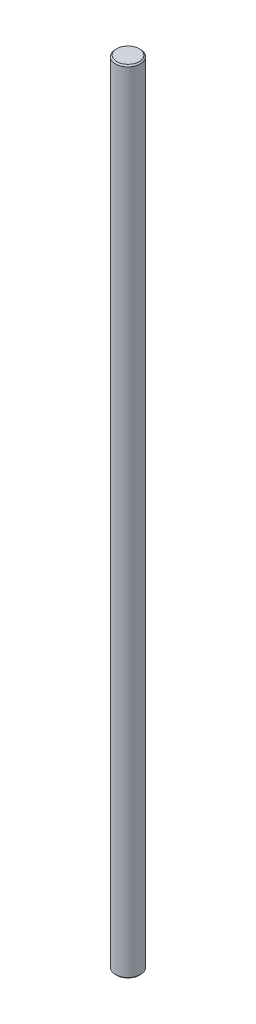
ISO-10303-21;
HEADER;
FILE_DESCRIPTION(('STEP AP214'),'2;1');
FILE_NAME('part.step','',(''),(''),'','','');
FILE_SCHEMA(('AUTOMOTIVE_DESIGN { 1 0 10303 214 1 1 1 1 }'));
ENDSEC;
DATA;
#1=APPLICATION_CONTEXT('core data for automotive mechanical design processes');
#2=APPLICATION_PROTOCOL_DEFINITION('international standard','automotive_design',2000,#1);
#3=PRODUCT_CONTEXT('',#1,'mechanical');
#4=PRODUCT('Part','Part','',(#3));
#5=PRODUCT_RELATED_PRODUCT_CATEGORY('part','',(#4));
#6=PRODUCT_DEFINITION_FORMATION('','',#4);
#7=PRODUCT_DEFINITION_CONTEXT('part definition',#1,'design');
#8=PRODUCT_DEFINITION('design','',#6,#7);
#9=PRODUCT_DEFINITION_SHAPE('','',#8);
#10=(LENGTH_UNIT() NAMED_UNIT(*) SI_UNIT(.MILLI.,.METRE.));
#11=(NAMED_UNIT(*) PLANE_ANGLE_UNIT() SI_UNIT($,.RADIAN.));
#12=(NAMED_UNIT(*) SI_UNIT($,.STERADIAN.) SOLID_ANGLE_UNIT());
#13=UNCERTAINTY_MEASURE_WITH_UNIT(LENGTH_MEASURE(1.E-05),#10,'distance_accuracy_value','');
#14=(GEOMETRIC_REPRESENTATION_CONTEXT(3) GLOBAL_UNCERTAINTY_ASSIGNED_CONTEXT((#13)) GLOBAL_UNIT_ASSIGNED_CONTEXT((#10,
#11,#12)) REPRESENTATION_CONTEXT('',''));
#15=CARTESIAN_POINT('',(0.,0.,0.));
#16=DIRECTION('',(0.,0.,1.));
#17=DIRECTION('',(1.,0.,0.));
#18=AXIS2_PLACEMENT_3D('',#15,#16,#17);
#19=CARTESIAN_POINT('',(0.,0.,0.));
#20=DIRECTION('',(0.,1.,0.));
#21=DIRECTION('',(1.,0.,0.));
#22=AXIS2_PLACEMENT_3D('',#19,#20,#21);
#23=PLANE('',#22);
#24=CARTESIAN_POINT('',(0.,0.,0.));
#25=DIRECTION('',(0.,-1.,0.));
#26=DIRECTION('',(1.,0.,0.));
#27=AXIS2_PLACEMENT_3D('',#24,#25,#26);
#28=CIRCLE('',#27,4.25);
#29=CARTESIAN_POINT('',(4.25,0.,0.));
#30=VERTEX_POINT('',#29);
#31=EDGE_CURVE('E10',#30,#30,#28,.T.);
#32=ORIENTED_EDGE('',*,*,#31,.T.);
#33=EDGE_LOOP('',(#32));
#34=FACE_BOUND('',#33,.T.);
#35=ADVANCED_FACE('F15',(#34),#23,.F.);
#36=CARTESIAN_POINT('',(0.,0.2499999743892,0.));
#37=DIRECTION('',(0.,1.,0.));
#38=DIRECTION('',(0.,0.,-1.));
#39=AXIS2_PLACEMENT_3D('',#36,#37,#38);
#40=CONICAL_SURFACE('',#39,4.499999974389,0.7853981633973);
#41=CARTESIAN_POINT('',(0.,0.5,0.));
#42=DIRECTION('',(0.,-1.,0.));
#43=DIRECTION('',(-1.,0.,0.));
#44=AXIS2_PLACEMENT_3D('',#41,#42,#43);
#45=CIRCLE('',#44,4.75);
#46=CARTESIAN_POINT('',(-4.75,0.5,0.));
#47=VERTEX_POINT('',#46);
#48=EDGE_CURVE('E23',#47,#47,#45,.T.);
#49=ORIENTED_EDGE('',*,*,#48,.T.);
#50=EDGE_LOOP('',(#49));
#51=FACE_BOUND('',#50,.T.);
#52=ORIENTED_EDGE('',*,*,#31,.F.);
#53=EDGE_LOOP('',(#52));
#54=FACE_BOUND('',#53,.T.);
#55=ADVANCED_FACE('F45',(#51,#54),#40,.T.);
#56=CARTESIAN_POINT('',(0.,0.,0.));
#57=DIRECTION('',(0.,1.,0.));
#58=DIRECTION('',(1.,0.,0.));
#59=AXIS2_PLACEMENT_3D('',#56,#57,#58);
#60=CYLINDRICAL_SURFACE('',#59,4.75);
#61=CARTESIAN_POINT('',(0.,299.5,0.));
#62=DIRECTION('',(0.,1.,0.));
#63=DIRECTION('',(-1.,0.,0.));
#64=AXIS2_PLACEMENT_3D('',#61,#62,#63);
#65=CIRCLE('',#64,4.75);
#66=CARTESIAN_POINT('',(-4.75,299.5,0.));
#67=VERTEX_POINT('',#66);
#68=EDGE_CURVE('E28',#67,#67,#65,.T.);
#69=ORIENTED_EDGE('',*,*,#68,.F.);
#70=EDGE_LOOP('',(#69));
#71=FACE_BOUND('',#70,.T.);
#72=ORIENTED_EDGE('',*,*,#48,.F.);
#73=EDGE_LOOP('',(#72));
#74=FACE_BOUND('',#73,.T.);
#75=ADVANCED_FACE('F39',(#71,#74),#60,.T.);
#76=CARTESIAN_POINT('',(0.,299.7500000256,0.));
#77=DIRECTION('',(0.,-1.,0.));
#78=DIRECTION('',(0.,0.,-1.));
#79=AXIS2_PLACEMENT_3D('',#76,#77,#78);
#80=CONICAL_SURFACE('',#79,4.499999974389,0.7853981633973);
#81=ORIENTED_EDGE('',*,*,#68,.T.);
#82=EDGE_LOOP('',(#81));
#83=FACE_BOUND('',#82,.T.);
#84=CARTESIAN_POINT('',(0.,300.,0.));
#85=DIRECTION('',(0.,1.,0.));
#86=DIRECTION('',(-1.,0.,0.));
#87=AXIS2_PLACEMENT_3D('',#84,#85,#86);
#88=CIRCLE('',#87,4.25);
#89=CARTESIAN_POINT('',(-4.25,300.,0.));
#90=VERTEX_POINT('',#89);
#91=EDGE_CURVE('E19',#90,#90,#88,.T.);
#92=ORIENTED_EDGE('',*,*,#91,.F.);
#93=EDGE_LOOP('',(#92));
#94=FACE_BOUND('',#93,.T.);
#95=ADVANCED_FACE('F37',(#83,#94),#80,.T.);
#96=CARTESIAN_POINT('',(0.,300.,0.));
#97=DIRECTION('',(0.,1.,0.));
#98=DIRECTION('',(1.,0.,0.));
#99=AXIS2_PLACEMENT_3D('',#96,#97,#98);
#100=PLANE('',#99);
#101=ORIENTED_EDGE('',*,*,#91,.T.);
#102=EDGE_LOOP('',(#101));
#103=FACE_BOUND('',#102,.T.);
#104=ADVANCED_FACE('F17',(#103),#100,.T.);
#105=CLOSED_SHELL('',(#35,#55,#75,#95,#104));
#106=MANIFOLD_SOLID_BREP('B1',#105);
#107=ADVANCED_BREP_SHAPE_REPRESENTATION('',(#18,#106),#14);
#108=SHAPE_DEFINITION_REPRESENTATION(#9,#107);
ENDSEC;
END-ISO-10303-21;
